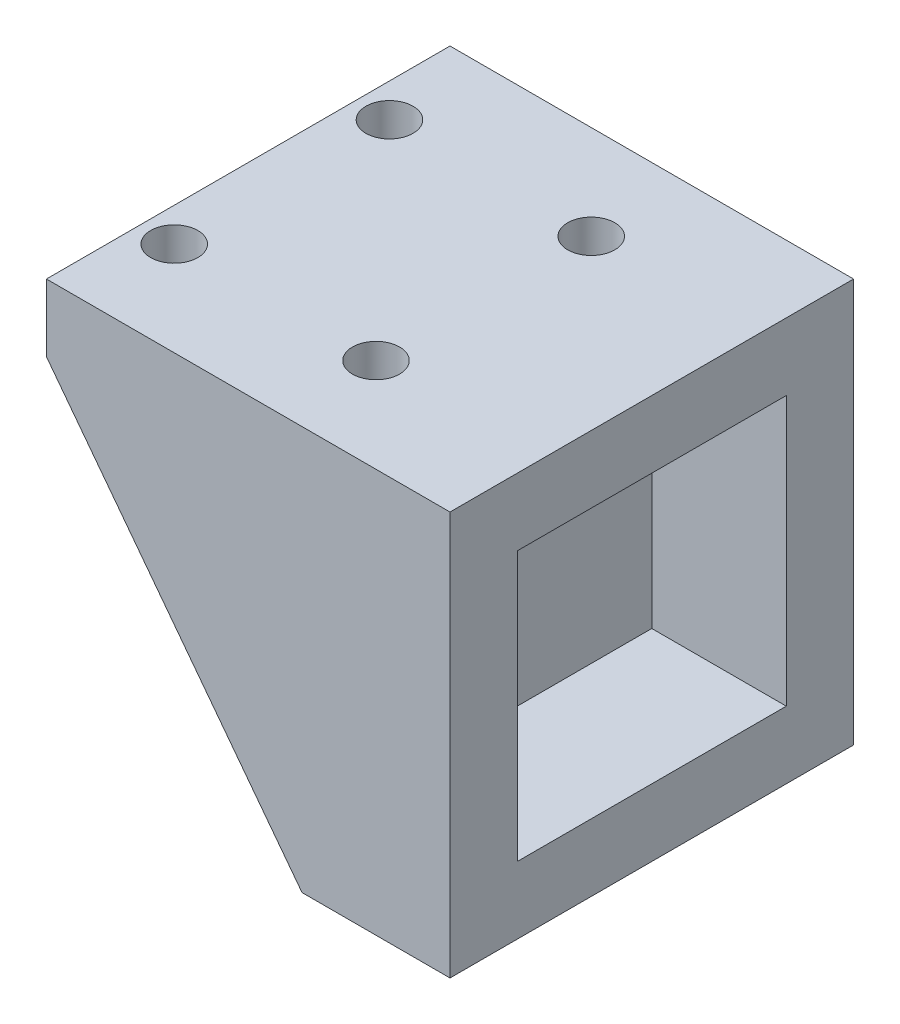
ISO-10303-21;
HEADER;
FILE_DESCRIPTION(('STEP AP214'),'2;1');
FILE_NAME('part.step','',(''),(''),'','','');
FILE_SCHEMA(('AUTOMOTIVE_DESIGN { 1 0 10303 214 1 1 1 1 }'));
ENDSEC;
DATA;
#1=APPLICATION_CONTEXT('core data for automotive mechanical design processes');
#2=APPLICATION_PROTOCOL_DEFINITION('international standard','automotive_design',2000,#1);
#3=PRODUCT_CONTEXT('',#1,'mechanical');
#4=PRODUCT('Part','Part','',(#3));
#5=PRODUCT_RELATED_PRODUCT_CATEGORY('part','',(#4));
#6=PRODUCT_DEFINITION_FORMATION('','',#4);
#7=PRODUCT_DEFINITION_CONTEXT('part definition',#1,'design');
#8=PRODUCT_DEFINITION('design','',#6,#7);
#9=PRODUCT_DEFINITION_SHAPE('','',#8);
#10=(LENGTH_UNIT() NAMED_UNIT(*) SI_UNIT(.MILLI.,.METRE.));
#11=(NAMED_UNIT(*) PLANE_ANGLE_UNIT() SI_UNIT($,.RADIAN.));
#12=(NAMED_UNIT(*) SI_UNIT($,.STERADIAN.) SOLID_ANGLE_UNIT());
#13=UNCERTAINTY_MEASURE_WITH_UNIT(LENGTH_MEASURE(1.E-05),#10,'distance_accuracy_value','');
#14=(GEOMETRIC_REPRESENTATION_CONTEXT(3) GLOBAL_UNCERTAINTY_ASSIGNED_CONTEXT((#13)) GLOBAL_UNIT_ASSIGNED_CONTEXT((#10,
#11,#12)) REPRESENTATION_CONTEXT('',''));
#15=CARTESIAN_POINT('',(0.,0.,0.));
#16=DIRECTION('',(0.,0.,1.));
#17=DIRECTION('',(1.,0.,0.));
#18=AXIS2_PLACEMENT_3D('',#15,#16,#17);
#19=CARTESIAN_POINT('',(17.5,5.,-7.));
#20=DIRECTION('',(0.,-1.,0.));
#21=DIRECTION('',(0.,0.,-1.));
#22=AXIS2_PLACEMENT_3D('',#19,#20,#21);
#23=CYLINDRICAL_SURFACE('',#22,1.75);
#24=CARTESIAN_POINT('',(17.5,5.,-7.));
#25=DIRECTION('',(0.,1.,0.));
#26=DIRECTION('',(0.,0.,1.));
#27=AXIS2_PLACEMENT_3D('',#24,#25,#26);
#28=CIRCLE('',#27,1.75);
#29=CARTESIAN_POINT('',(17.5,5.,-5.25));
#30=VERTEX_POINT('',#29);
#31=EDGE_CURVE('E229',#30,#30,#28,.T.);
#32=ORIENTED_EDGE('',*,*,#31,.T.);
#33=EDGE_LOOP('',(#32));
#34=FACE_BOUND('',#33,.T.);
#35=CARTESIAN_POINT('',(17.5,2.,-7.));
#36=DIRECTION('',(0.,-1.,0.));
#37=DIRECTION('',(0.,0.,-1.));
#38=AXIS2_PLACEMENT_3D('',#35,#36,#37);
#39=CIRCLE('',#38,1.75);
#40=CARTESIAN_POINT('',(17.5,2.,-8.75));
#41=VERTEX_POINT('',#40);
#42=EDGE_CURVE('E264',#41,#41,#39,.T.);
#43=ORIENTED_EDGE('',*,*,#42,.T.);
#44=EDGE_LOOP('',(#43));
#45=FACE_BOUND('',#44,.T.);
#46=ADVANCED_FACE('F33',(#34,#45),#23,.F.);
#47=CARTESIAN_POINT('',(17.5,5.,-23.));
#48=DIRECTION('',(0.,-1.,0.));
#49=DIRECTION('',(0.,0.,-1.));
#50=AXIS2_PLACEMENT_3D('',#47,#48,#49);
#51=CYLINDRICAL_SURFACE('',#50,1.75);
#52=CARTESIAN_POINT('',(17.5,5.,-23.));
#53=DIRECTION('',(0.,1.,0.));
#54=DIRECTION('',(0.,0.,1.));
#55=AXIS2_PLACEMENT_3D('',#52,#53,#54);
#56=CIRCLE('',#55,1.75);
#57=CARTESIAN_POINT('',(17.5,5.,-21.25));
#58=VERTEX_POINT('',#57);
#59=EDGE_CURVE('E215',#58,#58,#56,.T.);
#60=ORIENTED_EDGE('',*,*,#59,.T.);
#61=EDGE_LOOP('',(#60));
#62=FACE_BOUND('',#61,.T.);
#63=CARTESIAN_POINT('',(17.5,2.,-23.));
#64=DIRECTION('',(0.,-1.,0.));
#65=DIRECTION('',(0.,0.,-1.));
#66=AXIS2_PLACEMENT_3D('',#63,#64,#65);
#67=CIRCLE('',#66,1.75);
#68=CARTESIAN_POINT('',(17.5,2.,-24.75));
#69=VERTEX_POINT('',#68);
#70=EDGE_CURVE('E261',#69,#69,#67,.T.);
#71=ORIENTED_EDGE('',*,*,#70,.T.);
#72=EDGE_LOOP('',(#71));
#73=FACE_BOUND('',#72,.T.);
#74=ADVANCED_FACE('F401',(#62,#73),#51,.F.);
#75=CARTESIAN_POINT('',(0.,0.,0.));
#76=DIRECTION('',(0.,-1.,0.));
#77=DIRECTION('',(0.,0.,-1.));
#78=AXIS2_PLACEMENT_3D('',#75,#76,#77);
#79=PLANE('',#78);
#80=CARTESIAN_POINT('',(17.5,0.,-23.));
#81=DIRECTION('',(0.,-1.,0.));
#82=DIRECTION('',(0.,0.,-1.));
#83=AXIS2_PLACEMENT_3D('',#80,#81,#82);
#84=CIRCLE('',#83,2.9);
#85=CARTESIAN_POINT('',(19.,0.,-20.5180652708018));
#86=VERTEX_POINT('',#85);
#87=CARTESIAN_POINT('',(19.,0.,-25.4819347291982));
#88=VERTEX_POINT('',#87);
#89=EDGE_CURVE('E178',#86,#88,#84,.T.);
#90=ORIENTED_EDGE('',*,*,#89,.F.);
#91=DIRECTION('',(0.,0.,-1.));
#92=VECTOR('',#91,1.);
#93=CARTESIAN_POINT('',(19.,0.,0.));
#94=LINE('',#93,#92);
#95=CARTESIAN_POINT('',(19.,0.,-9.48193472919817));
#96=VERTEX_POINT('',#95);
#97=EDGE_CURVE('E163',#96,#86,#94,.T.);
#98=ORIENTED_EDGE('',*,*,#97,.F.);
#99=CARTESIAN_POINT('',(17.5,0.,-7.));
#100=DIRECTION('',(0.,-1.,0.));
#101=DIRECTION('',(0.,0.,-1.));
#102=AXIS2_PLACEMENT_3D('',#99,#100,#101);
#103=CIRCLE('',#102,2.9);
#104=CARTESIAN_POINT('',(19.,0.,-4.51806527080183));
#105=VERTEX_POINT('',#104);
#106=EDGE_CURVE('E169',#105,#96,#103,.T.);
#107=ORIENTED_EDGE('',*,*,#106,.F.);
#108=CARTESIAN_POINT('',(19.,0.,-2.99999999999999));
#109=VERTEX_POINT('',#108);
#110=EDGE_CURVE('E181',#109,#105,#94,.T.);
#111=ORIENTED_EDGE('',*,*,#110,.F.);
#112=DIRECTION('',(-1.,0.,0.));
#113=VECTOR('',#112,1.);
#114=CARTESIAN_POINT('',(0.,0.,-2.99999999999999));
#115=LINE('',#114,#113);
#116=CARTESIAN_POINT('',(0.,0.,-2.99999999999999));
#117=VERTEX_POINT('',#116);
#118=EDGE_CURVE('E338',#109,#117,#115,.T.);
#119=ORIENTED_EDGE('',*,*,#118,.T.);
#120=DIRECTION('',(0.,0.,1.));
#121=VECTOR('',#120,1.);
#122=CARTESIAN_POINT('',(0.,0.,0.));
#123=LINE('',#122,#121);
#124=CARTESIAN_POINT('',(0.,0.,-27.));
#125=VERTEX_POINT('',#124);
#126=EDGE_CURVE('E237',#125,#117,#123,.T.);
#127=ORIENTED_EDGE('',*,*,#126,.F.);
#128=DIRECTION('',(1.,0.,0.));
#129=VECTOR('',#128,1.);
#130=CARTESIAN_POINT('',(19.,0.,-27.));
#131=LINE('',#130,#129);
#132=CARTESIAN_POINT('',(19.,0.,-27.));
#133=VERTEX_POINT('',#132);
#134=EDGE_CURVE('E352',#125,#133,#131,.T.);
#135=ORIENTED_EDGE('',*,*,#134,.T.);
#136=EDGE_CURVE('E179',#88,#133,#94,.T.);
#137=ORIENTED_EDGE('',*,*,#136,.F.);
#138=EDGE_LOOP('',(#90,#98,#107,#111,#119,#127,#135,#137));
#139=FACE_BOUND('',#138,.T.);
#140=CARTESIAN_POINT('',(2.5,0.,-23.));
#141=DIRECTION('',(0.,1.,0.));
#142=DIRECTION('',(0.,0.,1.));
#143=AXIS2_PLACEMENT_3D('',#140,#141,#142);
#144=CIRCLE('',#143,1.75);
#145=CARTESIAN_POINT('',(2.5,0.,-21.25));
#146=VERTEX_POINT('',#145);
#147=EDGE_CURVE('E221',#146,#146,#144,.T.);
#148=ORIENTED_EDGE('',*,*,#147,.T.);
#149=EDGE_LOOP('',(#148));
#150=FACE_BOUND('',#149,.T.);
#151=CARTESIAN_POINT('',(2.5,0.,-7.));
#152=DIRECTION('',(0.,1.,0.));
#153=DIRECTION('',(0.,0.,1.));
#154=AXIS2_PLACEMENT_3D('',#151,#152,#153);
#155=CIRCLE('',#154,1.75);
#156=CARTESIAN_POINT('',(2.5,0.,-5.25));
#157=VERTEX_POINT('',#156);
#158=EDGE_CURVE('E233',#157,#157,#155,.T.);
#159=ORIENTED_EDGE('',*,*,#158,.T.);
#160=EDGE_LOOP('',(#159));
#161=FACE_BOUND('',#160,.T.);
#162=ADVANCED_FACE('F175',(#139,#150,#161),#79,.T.);
#163=CARTESIAN_POINT('',(19.,-25.,0.));
#164=DIRECTION('',(1.,0.,0.));
#165=DIRECTION('',(0.,0.,-1.));
#166=AXIS2_PLACEMENT_3D('',#163,#164,#165);
#167=PLANE('',#166);
#168=DIRECTION('',(0.,0.,-1.));
#169=VECTOR('',#168,1.);
#170=CARTESIAN_POINT('',(19.,-3.73205080756889,-25.4819347291982));
#171=LINE('',#170,#169);
#172=CARTESIAN_POINT('',(19.,-3.73205080756889,-20.5180652708018));
#173=VERTEX_POINT('',#172);
#174=CARTESIAN_POINT('',(19.,-3.73205080756889,-25.4819347291982));
#175=VERTEX_POINT('',#174);
#176=EDGE_CURVE('E271',#173,#175,#171,.T.);
#177=ORIENTED_EDGE('',*,*,#176,.T.);
#178=DIRECTION('',(0.,-1.,0.));
#179=VECTOR('',#178,1.);
#180=CARTESIAN_POINT('',(19.,-3.73205080756889,-25.4819347291982));
#181=LINE('',#180,#179);
#182=EDGE_CURVE('E273',#175,#88,#181,.F.);
#183=ORIENTED_EDGE('',*,*,#182,.T.);
#184=ORIENTED_EDGE('',*,*,#136,.T.);
#185=DIRECTION('',(0.,-1.,0.));
#186=VECTOR('',#185,1.);
#187=CARTESIAN_POINT('',(19.,-25.,-27.));
#188=LINE('',#187,#186);
#189=CARTESIAN_POINT('',(19.,-25.,-27.));
#190=VERTEX_POINT('',#189);
#191=EDGE_CURVE('E355',#133,#190,#188,.T.);
#192=ORIENTED_EDGE('',*,*,#191,.T.);
#193=DIRECTION('',(0.,0.,-1.));
#194=VECTOR('',#193,1.);
#195=CARTESIAN_POINT('',(19.,-25.,0.));
#196=LINE('',#195,#194);
#197=CARTESIAN_POINT('',(19.,-25.,-2.99999999999999));
#198=VERTEX_POINT('',#197);
#199=EDGE_CURVE('E210',#198,#190,#196,.T.);
#200=ORIENTED_EDGE('',*,*,#199,.F.);
#201=DIRECTION('',(0.,1.,0.));
#202=VECTOR('',#201,1.);
#203=CARTESIAN_POINT('',(19.,0.,-2.99999999999999));
#204=LINE('',#203,#202);
#205=EDGE_CURVE('E336',#198,#109,#204,.T.);
#206=ORIENTED_EDGE('',*,*,#205,.T.);
#207=ORIENTED_EDGE('',*,*,#110,.T.);
#208=DIRECTION('',(0.,-1.,0.));
#209=VECTOR('',#208,1.);
#210=CARTESIAN_POINT('',(19.,0.,-4.51806527080183));
#211=LINE('',#210,#209);
#212=CARTESIAN_POINT('',(19.,-3.73205080756887,-4.51806527080183));
#213=VERTEX_POINT('',#212);
#214=EDGE_CURVE('E47',#105,#213,#211,.T.);
#215=ORIENTED_EDGE('',*,*,#214,.T.);
#216=DIRECTION('',(0.,0.,-1.));
#217=VECTOR('',#216,1.);
#218=CARTESIAN_POINT('',(19.,-3.73205080756887,-9.48193472919817));
#219=LINE('',#218,#217);
#220=CARTESIAN_POINT('',(19.,-3.73205080756887,-9.48193472919817));
#221=VERTEX_POINT('',#220);
#222=EDGE_CURVE('E166',#213,#221,#219,.T.);
#223=ORIENTED_EDGE('',*,*,#222,.T.);
#224=DIRECTION('',(0.,-1.,0.));
#225=VECTOR('',#224,1.);
#226=CARTESIAN_POINT('',(19.,-3.73205080756887,-9.48193472919817));
#227=LINE('',#226,#225);
#228=EDGE_CURVE('E159',#221,#96,#227,.F.);
#229=ORIENTED_EDGE('',*,*,#228,.T.);
#230=ORIENTED_EDGE('',*,*,#97,.T.);
#231=DIRECTION('',(0.,-1.,0.));
#232=VECTOR('',#231,1.);
#233=CARTESIAN_POINT('',(19.,0.,-20.5180652708018));
#234=LINE('',#233,#232);
#235=EDGE_CURVE('E55',#86,#173,#234,.T.);
#236=ORIENTED_EDGE('',*,*,#235,.T.);
#237=EDGE_LOOP('',(#177,#183,#184,#192,#200,#206,#207,#215,#223,#229,#230,#236));
#238=FACE_BOUND('',#237,.T.);
#239=ADVANCED_FACE('F161',(#238),#167,.F.);
#240=CARTESIAN_POINT('',(0.,5.,0.));
#241=DIRECTION('',(0.,-1.,0.));
#242=DIRECTION('',(0.,0.,-1.));
#243=AXIS2_PLACEMENT_3D('',#240,#241,#242);
#244=PLANE('',#243);
#245=DIRECTION('',(0.,0.,1.));
#246=VECTOR('',#245,1.);
#247=CARTESIAN_POINT('',(0.,5.,0.));
#248=LINE('',#247,#246);
#249=CARTESIAN_POINT('',(0.,5.,-30.));
#250=VERTEX_POINT('',#249);
#251=CARTESIAN_POINT('',(0.,5.,0.));
#252=VERTEX_POINT('',#251);
#253=EDGE_CURVE('E240',#250,#252,#248,.T.);
#254=ORIENTED_EDGE('',*,*,#253,.T.);
#255=DIRECTION('',(1.,0.,0.));
#256=VECTOR('',#255,1.);
#257=CARTESIAN_POINT('',(0.,5.,0.));
#258=LINE('',#257,#256);
#259=CARTESIAN_POINT('',(30.,5.,0.));
#260=VERTEX_POINT('',#259);
#261=EDGE_CURVE('E243',#252,#260,#258,.T.);
#262=ORIENTED_EDGE('',*,*,#261,.T.);
#263=DIRECTION('',(0.,0.,-1.));
#264=VECTOR('',#263,1.);
#265=CARTESIAN_POINT('',(30.,5.,0.));
#266=LINE('',#265,#264);
#267=CARTESIAN_POINT('',(30.,5.,-30.));
#268=VERTEX_POINT('',#267);
#269=EDGE_CURVE('E246',#260,#268,#266,.T.);
#270=ORIENTED_EDGE('',*,*,#269,.T.);
#271=DIRECTION('',(-1.,0.,0.));
#272=VECTOR('',#271,1.);
#273=CARTESIAN_POINT('',(0.,5.,-30.));
#274=LINE('',#273,#272);
#275=EDGE_CURVE('E248',#268,#250,#274,.T.);
#276=ORIENTED_EDGE('',*,*,#275,.T.);
#277=EDGE_LOOP('',(#254,#262,#270,#276));
#278=FACE_BOUND('',#277,.T.);
#279=CARTESIAN_POINT('',(2.5,5.,-7.));
#280=DIRECTION('',(0.,1.,0.));
#281=DIRECTION('',(0.,0.,1.));
#282=AXIS2_PLACEMENT_3D('',#279,#280,#281);
#283=CIRCLE('',#282,1.75);
#284=CARTESIAN_POINT('',(2.5,5.,-5.25));
#285=VERTEX_POINT('',#284);
#286=EDGE_CURVE('E234',#285,#285,#283,.T.);
#287=ORIENTED_EDGE('',*,*,#286,.F.);
#288=EDGE_LOOP('',(#287));
#289=FACE_BOUND('',#288,.T.);
#290=ORIENTED_EDGE('',*,*,#31,.F.);
#291=EDGE_LOOP('',(#290));
#292=FACE_BOUND('',#291,.T.);
#293=CARTESIAN_POINT('',(2.5,5.,-23.));
#294=DIRECTION('',(0.,1.,0.));
#295=DIRECTION('',(0.,0.,1.));
#296=AXIS2_PLACEMENT_3D('',#293,#294,#295);
#297=CIRCLE('',#296,1.75);
#298=CARTESIAN_POINT('',(2.5,5.,-21.25));
#299=VERTEX_POINT('',#298);
#300=EDGE_CURVE('E225',#299,#299,#297,.T.);
#301=ORIENTED_EDGE('',*,*,#300,.F.);
#302=EDGE_LOOP('',(#301));
#303=FACE_BOUND('',#302,.T.);
#304=ORIENTED_EDGE('',*,*,#59,.F.);
#305=EDGE_LOOP('',(#304));
#306=FACE_BOUND('',#305,.T.);
#307=ADVANCED_FACE('F416',(#278,#289,#292,#303,#306),#244,.F.);
#308=CARTESIAN_POINT('',(0.,5.,0.));
#309=DIRECTION('',(1.,0.,0.));
#310=DIRECTION('',(0.,0.,-1.));
#311=AXIS2_PLACEMENT_3D('',#308,#309,#310);
#312=PLANE('',#311);
#313=CARTESIAN_POINT('',(0.,0.,-30.));
#314=VERTEX_POINT('',#313);
#315=EDGE_CURVE('E244',#314,#125,#123,.T.);
#316=ORIENTED_EDGE('',*,*,#315,.T.);
#317=ORIENTED_EDGE('',*,*,#126,.T.);
#318=DIRECTION('',(0.,0.,1.));
#319=VECTOR('',#318,1.);
#320=CARTESIAN_POINT('',(0.,0.,-2.99999999999999));
#321=LINE('',#320,#319);
#322=CARTESIAN_POINT('',(0.,0.,0.));
#323=VERTEX_POINT('',#322);
#324=EDGE_CURVE('E343',#117,#323,#321,.T.);
#325=ORIENTED_EDGE('',*,*,#324,.T.);
#326=DIRECTION('',(0.,-1.,0.));
#327=VECTOR('',#326,1.);
#328=CARTESIAN_POINT('',(0.,5.,0.));
#329=LINE('',#328,#327);
#330=EDGE_CURVE('E183',#252,#323,#329,.T.);
#331=ORIENTED_EDGE('',*,*,#330,.F.);
#332=ORIENTED_EDGE('',*,*,#253,.F.);
#333=DIRECTION('',(0.,-1.,0.));
#334=VECTOR('',#333,1.);
#335=CARTESIAN_POINT('',(0.,5.,-30.));
#336=LINE('',#335,#334);
#337=EDGE_CURVE('E250',#250,#314,#336,.T.);
#338=ORIENTED_EDGE('',*,*,#337,.T.);
#339=EDGE_LOOP('',(#316,#317,#325,#331,#332,#338));
#340=FACE_BOUND('',#339,.T.);
#341=ADVANCED_FACE('F382',(#340),#312,.F.);
#342=CARTESIAN_POINT('',(0.,5.,0.));
#343=DIRECTION('',(0.,0.,-1.));
#344=DIRECTION('',(-1.,0.,0.));
#345=AXIS2_PLACEMENT_3D('',#342,#343,#344);
#346=PLANE('',#345);
#347=ORIENTED_EDGE('',*,*,#330,.T.);
#348=DIRECTION('',(0.605083267533558,-0.796162194123103,0.));
#349=VECTOR('',#348,1.);
#350=CARTESIAN_POINT('',(19.,-25.,0.));
#351=LINE('',#350,#349);
#352=CARTESIAN_POINT('',(19.,-25.,0.));
#353=VERTEX_POINT('',#352);
#354=EDGE_CURVE('E267',#323,#353,#351,.T.);
#355=ORIENTED_EDGE('',*,*,#354,.T.);
#356=DIRECTION('',(-1.,0.,0.));
#357=VECTOR('',#356,1.);
#358=CARTESIAN_POINT('',(30.,-25.,0.));
#359=LINE('',#358,#357);
#360=CARTESIAN_POINT('',(30.,-25.,0.));
#361=VERTEX_POINT('',#360);
#362=EDGE_CURVE('E190',#361,#353,#359,.T.);
#363=ORIENTED_EDGE('',*,*,#362,.F.);
#364=DIRECTION('',(0.,-1.,0.));
#365=VECTOR('',#364,1.);
#366=CARTESIAN_POINT('',(30.,5.,0.));
#367=LINE('',#366,#365);
#368=EDGE_CURVE('E257',#260,#361,#367,.T.);
#369=ORIENTED_EDGE('',*,*,#368,.F.);
#370=ORIENTED_EDGE('',*,*,#261,.F.);
#371=EDGE_LOOP('',(#347,#355,#363,#369,#370));
#372=FACE_BOUND('',#371,.T.);
#373=ADVANCED_FACE('F375',(#372),#346,.F.);
#374=CARTESIAN_POINT('',(30.,5.,0.));
#375=DIRECTION('',(-1.,0.,0.));
#376=DIRECTION('',(0.,0.,1.));
#377=AXIS2_PLACEMENT_3D('',#374,#375,#376);
#378=PLANE('',#377);
#379=DIRECTION('',(0.,0.,1.));
#380=VECTOR('',#379,1.);
#381=CARTESIAN_POINT('',(30.,0.,-25.));
#382=LINE('',#381,#380);
#383=CARTESIAN_POINT('',(30.,0.,-25.));
#384=VERTEX_POINT('',#383);
#385=CARTESIAN_POINT('',(30.,0.,-4.99999999999999));
#386=VERTEX_POINT('',#385);
#387=EDGE_CURVE('E315',#384,#386,#382,.T.);
#388=ORIENTED_EDGE('',*,*,#387,.F.);
#389=DIRECTION('',(0.,1.,0.));
#390=VECTOR('',#389,1.);
#391=CARTESIAN_POINT('',(30.,-20.,-25.));
#392=LINE('',#391,#390);
#393=CARTESIAN_POINT('',(30.,-20.,-25.));
#394=VERTEX_POINT('',#393);
#395=EDGE_CURVE('E313',#394,#384,#392,.T.);
#396=ORIENTED_EDGE('',*,*,#395,.F.);
#397=DIRECTION('',(0.,0.,-1.));
#398=VECTOR('',#397,1.);
#399=CARTESIAN_POINT('',(30.,-20.,-25.));
#400=LINE('',#399,#398);
#401=CARTESIAN_POINT('',(30.,-20.,-4.99999999999999));
#402=VERTEX_POINT('',#401);
#403=EDGE_CURVE('E200',#402,#394,#400,.T.);
#404=ORIENTED_EDGE('',*,*,#403,.F.);
#405=DIRECTION('',(0.,-1.,0.));
#406=VECTOR('',#405,1.);
#407=CARTESIAN_POINT('',(30.,-20.,-4.99999999999999));
#408=LINE('',#407,#406);
#409=EDGE_CURVE('E318',#386,#402,#408,.T.);
#410=ORIENTED_EDGE('',*,*,#409,.F.);
#411=EDGE_LOOP('',(#388,#396,#404,#410));
#412=FACE_BOUND('',#411,.T.);
#413=ORIENTED_EDGE('',*,*,#368,.T.);
#414=DIRECTION('',(0.,0.,1.));
#415=VECTOR('',#414,1.);
#416=CARTESIAN_POINT('',(30.,-25.,0.));
#417=LINE('',#416,#415);
#418=CARTESIAN_POINT('',(30.,-25.,-30.));
#419=VERTEX_POINT('',#418);
#420=EDGE_CURVE('E186',#419,#361,#417,.T.);
#421=ORIENTED_EDGE('',*,*,#420,.F.);
#422=DIRECTION('',(0.,-1.,0.));
#423=VECTOR('',#422,1.);
#424=CARTESIAN_POINT('',(30.,5.,-30.));
#425=LINE('',#424,#423);
#426=EDGE_CURVE('E255',#268,#419,#425,.T.);
#427=ORIENTED_EDGE('',*,*,#426,.F.);
#428=ORIENTED_EDGE('',*,*,#269,.F.);
#429=EDGE_LOOP('',(#413,#421,#427,#428));
#430=FACE_BOUND('',#429,.T.);
#431=ADVANCED_FACE('F371',(#412,#430),#378,.F.);
#432=CARTESIAN_POINT('',(0.,5.,-30.));
#433=DIRECTION('',(0.,0.,1.));
#434=DIRECTION('',(1.,0.,0.));
#435=AXIS2_PLACEMENT_3D('',#432,#433,#434);
#436=PLANE('',#435);
#437=DIRECTION('',(-0.605083267533558,0.796162194123102,0.));
#438=VECTOR('',#437,1.);
#439=CARTESIAN_POINT('',(0.,0.,-30.));
#440=LINE('',#439,#438);
#441=CARTESIAN_POINT('',(19.,-25.,-30.));
#442=VERTEX_POINT('',#441);
#443=EDGE_CURVE('E348',#442,#314,#440,.T.);
#444=ORIENTED_EDGE('',*,*,#443,.T.);
#445=ORIENTED_EDGE('',*,*,#337,.F.);
#446=ORIENTED_EDGE('',*,*,#275,.F.);
#447=ORIENTED_EDGE('',*,*,#426,.T.);
#448=DIRECTION('',(1.,0.,0.));
#449=VECTOR('',#448,1.);
#450=CARTESIAN_POINT('',(30.,-25.,-30.));
#451=LINE('',#450,#449);
#452=EDGE_CURVE('E213',#442,#419,#451,.T.);
#453=ORIENTED_EDGE('',*,*,#452,.F.);
#454=EDGE_LOOP('',(#444,#445,#446,#447,#453));
#455=FACE_BOUND('',#454,.T.);
#456=ADVANCED_FACE('F365',(#455),#436,.F.);
#457=CARTESIAN_POINT('',(2.5,5.,-7.));
#458=DIRECTION('',(0.,-1.,0.));
#459=DIRECTION('',(0.,0.,-1.));
#460=AXIS2_PLACEMENT_3D('',#457,#458,#459);
#461=CYLINDRICAL_SURFACE('',#460,1.75);
#462=ORIENTED_EDGE('',*,*,#286,.T.);
#463=EDGE_LOOP('',(#462));
#464=FACE_BOUND('',#463,.T.);
#465=ORIENTED_EDGE('',*,*,#158,.F.);
#466=EDGE_LOOP('',(#465));
#467=FACE_BOUND('',#466,.T.);
#468=ADVANCED_FACE('F412',(#464,#467),#461,.F.);
#469=CARTESIAN_POINT('',(2.5,5.,-23.));
#470=DIRECTION('',(0.,-1.,0.));
#471=DIRECTION('',(0.,0.,-1.));
#472=AXIS2_PLACEMENT_3D('',#469,#470,#471);
#473=CYLINDRICAL_SURFACE('',#472,1.75);
#474=ORIENTED_EDGE('',*,*,#300,.T.);
#475=EDGE_LOOP('',(#474));
#476=FACE_BOUND('',#475,.T.);
#477=ORIENTED_EDGE('',*,*,#147,.F.);
#478=EDGE_LOOP('',(#477));
#479=FACE_BOUND('',#478,.T.);
#480=ADVANCED_FACE('F411',(#476,#479),#473,.F.);
#481=CARTESIAN_POINT('',(0.,-25.,0.));
#482=DIRECTION('',(0.,1.,0.));
#483=DIRECTION('',(0.,0.,1.));
#484=AXIS2_PLACEMENT_3D('',#481,#482,#483);
#485=PLANE('',#484);
#486=ORIENTED_EDGE('',*,*,#420,.T.);
#487=ORIENTED_EDGE('',*,*,#362,.T.);
#488=EDGE_CURVE('E211',#353,#198,#196,.T.);
#489=ORIENTED_EDGE('',*,*,#488,.T.);
#490=ORIENTED_EDGE('',*,*,#199,.T.);
#491=DIRECTION('',(0.,0.,-1.));
#492=VECTOR('',#491,1.);
#493=CARTESIAN_POINT('',(19.,-25.,-27.));
#494=LINE('',#493,#492);
#495=EDGE_CURVE('E316',#190,#442,#494,.T.);
#496=ORIENTED_EDGE('',*,*,#495,.T.);
#497=ORIENTED_EDGE('',*,*,#452,.T.);
#498=EDGE_LOOP('',(#486,#487,#489,#490,#496,#497));
#499=FACE_BOUND('',#498,.T.);
#500=ADVANCED_FACE('F360',(#499),#485,.F.);
#501=CARTESIAN_POINT('',(20.,-20.,-25.));
#502=DIRECTION('',(0.,0.,-1.));
#503=DIRECTION('',(0.,1.,0.));
#504=AXIS2_PLACEMENT_3D('',#501,#502,#503);
#505=PLANE('',#504);
#506=ORIENTED_EDGE('',*,*,#395,.T.);
#507=DIRECTION('',(1.,0.,0.));
#508=VECTOR('',#507,1.);
#509=CARTESIAN_POINT('',(20.,0.,-25.));
#510=LINE('',#509,#508);
#511=CARTESIAN_POINT('',(20.,0.,-25.));
#512=VERTEX_POINT('',#511);
#513=EDGE_CURVE('E204',#512,#384,#510,.T.);
#514=ORIENTED_EDGE('',*,*,#513,.F.);
#515=DIRECTION('',(0.,1.,0.));
#516=VECTOR('',#515,1.);
#517=CARTESIAN_POINT('',(20.,-20.,-25.));
#518=LINE('',#517,#516);
#519=CARTESIAN_POINT('',(20.,-20.,-25.));
#520=VERTEX_POINT('',#519);
#521=EDGE_CURVE('E303',#520,#512,#518,.T.);
#522=ORIENTED_EDGE('',*,*,#521,.F.);
#523=DIRECTION('',(1.,0.,0.));
#524=VECTOR('',#523,1.);
#525=CARTESIAN_POINT('',(20.,-20.,-25.));
#526=LINE('',#525,#524);
#527=EDGE_CURVE('E187',#520,#394,#526,.T.);
#528=ORIENTED_EDGE('',*,*,#527,.T.);
#529=EDGE_LOOP('',(#506,#514,#522,#528));
#530=FACE_BOUND('',#529,.T.);
#531=ADVANCED_FACE('F327',(#530),#505,.F.);
#532=CARTESIAN_POINT('',(20.,-20.,-25.));
#533=DIRECTION('',(0.,-1.,0.));
#534=DIRECTION('',(0.,0.,-1.));
#535=AXIS2_PLACEMENT_3D('',#532,#533,#534);
#536=PLANE('',#535);
#537=ORIENTED_EDGE('',*,*,#403,.T.);
#538=ORIENTED_EDGE('',*,*,#527,.F.);
#539=DIRECTION('',(0.,0.,-1.));
#540=VECTOR('',#539,1.);
#541=CARTESIAN_POINT('',(20.,-20.,-25.));
#542=LINE('',#541,#540);
#543=CARTESIAN_POINT('',(20.,-20.,-4.99999999999999));
#544=VERTEX_POINT('',#543);
#545=EDGE_CURVE('E206',#544,#520,#542,.T.);
#546=ORIENTED_EDGE('',*,*,#545,.F.);
#547=DIRECTION('',(1.,0.,0.));
#548=VECTOR('',#547,1.);
#549=CARTESIAN_POINT('',(20.,-20.,-4.99999999999999));
#550=LINE('',#549,#548);
#551=EDGE_CURVE('E192',#544,#402,#550,.T.);
#552=ORIENTED_EDGE('',*,*,#551,.T.);
#553=EDGE_LOOP('',(#537,#538,#546,#552));
#554=FACE_BOUND('',#553,.T.);
#555=ADVANCED_FACE('F567',(#554),#536,.F.);
#556=CARTESIAN_POINT('',(20.,-20.,-4.99999999999999));
#557=DIRECTION('',(0.,0.,1.));
#558=DIRECTION('',(0.,-1.,0.));
#559=AXIS2_PLACEMENT_3D('',#556,#557,#558);
#560=PLANE('',#559);
#561=ORIENTED_EDGE('',*,*,#409,.T.);
#562=ORIENTED_EDGE('',*,*,#551,.F.);
#563=DIRECTION('',(0.,-1.,0.));
#564=VECTOR('',#563,1.);
#565=CARTESIAN_POINT('',(20.,-20.,-4.99999999999999));
#566=LINE('',#565,#564);
#567=CARTESIAN_POINT('',(20.,0.,-4.99999999999999));
#568=VERTEX_POINT('',#567);
#569=EDGE_CURVE('E307',#568,#544,#566,.T.);
#570=ORIENTED_EDGE('',*,*,#569,.F.);
#571=DIRECTION('',(1.,0.,0.));
#572=VECTOR('',#571,1.);
#573=CARTESIAN_POINT('',(20.,0.,-4.99999999999999));
#574=LINE('',#573,#572);
#575=EDGE_CURVE('E197',#568,#386,#574,.T.);
#576=ORIENTED_EDGE('',*,*,#575,.T.);
#577=EDGE_LOOP('',(#561,#562,#570,#576));
#578=FACE_BOUND('',#577,.T.);
#579=ADVANCED_FACE('F507',(#578),#560,.F.);
#580=CARTESIAN_POINT('',(20.,0.,-25.));
#581=DIRECTION('',(0.,1.,0.));
#582=DIRECTION('',(0.,0.,1.));
#583=AXIS2_PLACEMENT_3D('',#580,#581,#582);
#584=PLANE('',#583);
#585=DIRECTION('',(0.,0.,1.));
#586=VECTOR('',#585,1.);
#587=CARTESIAN_POINT('',(20.,0.,-25.));
#588=LINE('',#587,#586);
#589=CARTESIAN_POINT('',(20.,0.,-21.5303061543301));
#590=VERTEX_POINT('',#589);
#591=CARTESIAN_POINT('',(20.,0.,-8.46969384566992));
#592=VERTEX_POINT('',#591);
#593=EDGE_CURVE('E287',#590,#592,#588,.T.);
#594=ORIENTED_EDGE('',*,*,#593,.F.);
#595=CARTESIAN_POINT('',(20.,0.,-24.4696938456699));
#596=VERTEX_POINT('',#595);
#597=EDGE_CURVE('E329',#596,#590,#84,.T.);
#598=ORIENTED_EDGE('',*,*,#597,.F.);
#599=EDGE_CURVE('E304',#512,#596,#588,.T.);
#600=ORIENTED_EDGE('',*,*,#599,.F.);
#601=ORIENTED_EDGE('',*,*,#513,.T.);
#602=ORIENTED_EDGE('',*,*,#387,.T.);
#603=ORIENTED_EDGE('',*,*,#575,.F.);
#604=CARTESIAN_POINT('',(20.,0.,-5.53030615433009));
#605=VERTEX_POINT('',#604);
#606=EDGE_CURVE('E290',#605,#568,#588,.T.);
#607=ORIENTED_EDGE('',*,*,#606,.F.);
#608=EDGE_CURVE('E173',#592,#605,#103,.T.);
#609=ORIENTED_EDGE('',*,*,#608,.F.);
#610=EDGE_LOOP('',(#594,#598,#600,#601,#602,#603,#607,#609));
#611=FACE_BOUND('',#610,.T.);
#612=ADVANCED_FACE('F285',(#611),#584,.F.);
#613=CARTESIAN_POINT('',(20.,0.,0.));
#614=DIRECTION('',(1.,0.,0.));
#615=DIRECTION('',(0.,0.,-1.));
#616=AXIS2_PLACEMENT_3D('',#613,#614,#615);
#617=PLANE('',#616);
#618=ORIENTED_EDGE('',*,*,#521,.T.);
#619=ORIENTED_EDGE('',*,*,#599,.T.);
#620=EDGE_CURVE('E300',#596,#590,#588,.T.);
#621=ORIENTED_EDGE('',*,*,#620,.T.);
#622=ORIENTED_EDGE('',*,*,#593,.T.);
#623=EDGE_CURVE('E296',#592,#605,#588,.T.);
#624=ORIENTED_EDGE('',*,*,#623,.T.);
#625=ORIENTED_EDGE('',*,*,#606,.T.);
#626=ORIENTED_EDGE('',*,*,#569,.T.);
#627=ORIENTED_EDGE('',*,*,#545,.T.);
#628=EDGE_LOOP('',(#618,#619,#621,#622,#624,#625,#626,#627));
#629=FACE_BOUND('',#628,.T.);
#630=ADVANCED_FACE('F295',(#629),#617,.T.);
#631=CARTESIAN_POINT('',(0.,0.,-27.));
#632=DIRECTION('',(-0.796162194123103,-0.605083267533558,0.));
#633=DIRECTION('',(0.605083267533558,-0.796162194123103,0.));
#634=AXIS2_PLACEMENT_3D('',#631,#632,#633);
#635=PLANE('',#634);
#636=ORIENTED_EDGE('',*,*,#443,.F.);
#637=ORIENTED_EDGE('',*,*,#495,.F.);
#638=DIRECTION('',(-0.605083267533558,0.796162194123102,0.));
#639=VECTOR('',#638,1.);
#640=CARTESIAN_POINT('',(0.,0.,-27.));
#641=LINE('',#640,#639);
#642=EDGE_CURVE('E349',#190,#125,#641,.T.);
#643=ORIENTED_EDGE('',*,*,#642,.T.);
#644=ORIENTED_EDGE('',*,*,#315,.F.);
#645=EDGE_LOOP('',(#636,#637,#643,#644));
#646=FACE_BOUND('',#645,.T.);
#647=ADVANCED_FACE('F391',(#646),#635,.T.);
#648=CARTESIAN_POINT('',(0.,0.,-27.));
#649=DIRECTION('',(0.,0.,-1.));
#650=DIRECTION('',(-1.,0.,0.));
#651=AXIS2_PLACEMENT_3D('',#648,#649,#650);
#652=PLANE('',#651);
#653=ORIENTED_EDGE('',*,*,#642,.F.);
#654=ORIENTED_EDGE('',*,*,#191,.F.);
#655=ORIENTED_EDGE('',*,*,#134,.F.);
#656=EDGE_LOOP('',(#653,#654,#655));
#657=FACE_BOUND('',#656,.T.);
#658=ADVANCED_FACE('F390',(#657),#652,.F.);
#659=CARTESIAN_POINT('',(19.,-25.,-2.99999999999999));
#660=DIRECTION('',(-0.796162194123103,-0.605083267533558,0.));
#661=DIRECTION('',(0.605083267533558,-0.796162194123103,0.));
#662=AXIS2_PLACEMENT_3D('',#659,#660,#661);
#663=PLANE('',#662);
#664=ORIENTED_EDGE('',*,*,#354,.F.);
#665=ORIENTED_EDGE('',*,*,#324,.F.);
#666=DIRECTION('',(0.605083267533558,-0.796162194123103,0.));
#667=VECTOR('',#666,1.);
#668=CARTESIAN_POINT('',(19.,-25.,-2.99999999999999));
#669=LINE('',#668,#667);
#670=EDGE_CURVE('E341',#117,#198,#669,.T.);
#671=ORIENTED_EDGE('',*,*,#670,.T.);
#672=ORIENTED_EDGE('',*,*,#488,.F.);
#673=EDGE_LOOP('',(#664,#665,#671,#672));
#674=FACE_BOUND('',#673,.T.);
#675=ADVANCED_FACE('F378',(#674),#663,.T.);
#676=CARTESIAN_POINT('',(0.,0.,-2.99999999999999));
#677=DIRECTION('',(0.,0.,1.));
#678=DIRECTION('',(1.,0.,0.));
#679=AXIS2_PLACEMENT_3D('',#676,#677,#678);
#680=PLANE('',#679);
#681=ORIENTED_EDGE('',*,*,#205,.F.);
#682=ORIENTED_EDGE('',*,*,#670,.F.);
#683=ORIENTED_EDGE('',*,*,#118,.F.);
#684=EDGE_LOOP('',(#681,#682,#683));
#685=FACE_BOUND('',#684,.T.);
#686=ADVANCED_FACE('F387',(#685),#680,.F.);
#687=CARTESIAN_POINT('',(17.5,2.,-7.));
#688=DIRECTION('',(0.,-1.,0.));
#689=DIRECTION('',(0.,0.,-1.));
#690=AXIS2_PLACEMENT_3D('',#687,#688,#689);
#691=CYLINDRICAL_SURFACE('',#690,2.9);
#692=CARTESIAN_POINT('',(17.5,2.,-7.));
#693=DIRECTION('',(0.,-1.,0.));
#694=DIRECTION('',(0.,0.,-1.));
#695=AXIS2_PLACEMENT_3D('',#692,#693,#694);
#696=CIRCLE('',#695,2.9);
#697=CARTESIAN_POINT('',(17.5,2.,-9.9));
#698=VERTEX_POINT('',#697);
#699=EDGE_CURVE('E292',#698,#698,#696,.T.);
#700=ORIENTED_EDGE('',*,*,#699,.F.);
#701=EDGE_LOOP('',(#700));
#702=FACE_BOUND('',#701,.T.);
#703=ORIENTED_EDGE('',*,*,#106,.T.);
#704=ORIENTED_EDGE('',*,*,#228,.F.);
#705=CARTESIAN_POINT('',(17.5,-9.33012701892217,-7.));
#706=DIRECTION('',(-0.965925826289068,0.258819045102521,0.));
#707=DIRECTION('',(-0.258819045102521,-0.965925826289068,0.));
#708=AXIS2_PLACEMENT_3D('',#705,#706,#707);
#709=ELLIPSE('',#708,11.2047395849532,2.9);
#710=EDGE_CURVE('E41',#221,#592,#709,.F.);
#711=ORIENTED_EDGE('',*,*,#710,.T.);
#712=ORIENTED_EDGE('',*,*,#608,.T.);
#713=CARTESIAN_POINT('',(17.5,-9.33012701892217,-7.));
#714=DIRECTION('',(-0.965925826289068,0.258819045102521,0.));
#715=DIRECTION('',(-0.258819045102521,-0.965925826289068,0.));
#716=AXIS2_PLACEMENT_3D('',#713,#714,#715);
#717=ELLIPSE('',#716,11.2047395849532,2.9);
#718=EDGE_CURVE('E11',#605,#213,#717,.F.);
#719=ORIENTED_EDGE('',*,*,#718,.T.);
#720=ORIENTED_EDGE('',*,*,#214,.F.);
#721=EDGE_LOOP('',(#703,#704,#711,#712,#719,#720));
#722=FACE_BOUND('',#721,.T.);
#723=ADVANCED_FACE('F170',(#702,#722),#691,.F.);
#724=CARTESIAN_POINT('',(17.5,2.,-7.));
#725=DIRECTION('',(0.,-1.,0.));
#726=DIRECTION('',(0.,0.,-1.));
#727=AXIS2_PLACEMENT_3D('',#724,#725,#726);
#728=PLANE('',#727);
#729=ORIENTED_EDGE('',*,*,#42,.F.);
#730=EDGE_LOOP('',(#729));
#731=FACE_BOUND('',#730,.T.);
#732=ORIENTED_EDGE('',*,*,#699,.T.);
#733=EDGE_LOOP('',(#732));
#734=FACE_BOUND('',#733,.T.);
#735=ADVANCED_FACE('F444',(#731,#734),#728,.T.);
#736=CARTESIAN_POINT('',(17.5,2.,-23.));
#737=DIRECTION('',(0.,-1.,0.));
#738=DIRECTION('',(0.,0.,-1.));
#739=AXIS2_PLACEMENT_3D('',#736,#737,#738);
#740=CYLINDRICAL_SURFACE('',#739,2.9);
#741=CARTESIAN_POINT('',(17.5,2.,-23.));
#742=DIRECTION('',(0.,-1.,0.));
#743=DIRECTION('',(0.,0.,-1.));
#744=AXIS2_PLACEMENT_3D('',#741,#742,#743);
#745=CIRCLE('',#744,2.9);
#746=CARTESIAN_POINT('',(17.5,2.,-25.9));
#747=VERTEX_POINT('',#746);
#748=EDGE_CURVE('E265',#747,#747,#745,.T.);
#749=ORIENTED_EDGE('',*,*,#748,.F.);
#750=EDGE_LOOP('',(#749));
#751=FACE_BOUND('',#750,.T.);
#752=ORIENTED_EDGE('',*,*,#89,.T.);
#753=ORIENTED_EDGE('',*,*,#182,.F.);
#754=CARTESIAN_POINT('',(17.5,-9.3301270189222,-23.));
#755=DIRECTION('',(-0.965925826289068,0.258819045102521,0.));
#756=DIRECTION('',(-0.258819045102521,-0.965925826289068,0.));
#757=AXIS2_PLACEMENT_3D('',#754,#755,#756);
#758=ELLIPSE('',#757,11.2047395849532,2.9);
#759=EDGE_CURVE('E275',#175,#596,#758,.F.);
#760=ORIENTED_EDGE('',*,*,#759,.T.);
#761=ORIENTED_EDGE('',*,*,#597,.T.);
#762=CARTESIAN_POINT('',(17.5,-9.3301270189222,-23.));
#763=DIRECTION('',(-0.965925826289068,0.258819045102521,0.));
#764=DIRECTION('',(-0.258819045102521,-0.965925826289068,0.));
#765=AXIS2_PLACEMENT_3D('',#762,#763,#764);
#766=ELLIPSE('',#765,11.2047395849532,2.9);
#767=EDGE_CURVE('E277',#590,#173,#766,.F.);
#768=ORIENTED_EDGE('',*,*,#767,.T.);
#769=ORIENTED_EDGE('',*,*,#235,.F.);
#770=EDGE_LOOP('',(#752,#753,#760,#761,#768,#769));
#771=FACE_BOUND('',#770,.T.);
#772=ADVANCED_FACE('F438',(#751,#771),#740,.F.);
#773=CARTESIAN_POINT('',(17.5,2.,-23.));
#774=DIRECTION('',(0.,-1.,0.));
#775=DIRECTION('',(0.,0.,-1.));
#776=AXIS2_PLACEMENT_3D('',#773,#774,#775);
#777=PLANE('',#776);
#778=ORIENTED_EDGE('',*,*,#70,.F.);
#779=EDGE_LOOP('',(#778));
#780=FACE_BOUND('',#779,.T.);
#781=ORIENTED_EDGE('',*,*,#748,.T.);
#782=EDGE_LOOP('',(#781));
#783=FACE_BOUND('',#782,.T.);
#784=ADVANCED_FACE('F432',(#780,#783),#777,.T.);
#785=CARTESIAN_POINT('',(19.,-3.73205080756889,0.));
#786=DIRECTION('',(-0.965925826289068,0.258819045102521,0.));
#787=DIRECTION('',(0.,0.,1.));
#788=AXIS2_PLACEMENT_3D('',#785,#786,#787);
#789=PLANE('',#788);
#790=ORIENTED_EDGE('',*,*,#767,.F.);
#791=ORIENTED_EDGE('',*,*,#620,.F.);
#792=ORIENTED_EDGE('',*,*,#759,.F.);
#793=ORIENTED_EDGE('',*,*,#176,.F.);
#794=EDGE_LOOP('',(#790,#791,#792,#793));
#795=FACE_BOUND('',#794,.T.);
#796=ADVANCED_FACE('F430',(#795),#789,.T.);
#797=CARTESIAN_POINT('',(19.,-3.73205080756887,0.));
#798=DIRECTION('',(-0.965925826289068,0.258819045102521,0.));
#799=DIRECTION('',(0.,0.,1.));
#800=AXIS2_PLACEMENT_3D('',#797,#798,#799);
#801=PLANE('',#800);
#802=ORIENTED_EDGE('',*,*,#718,.F.);
#803=ORIENTED_EDGE('',*,*,#623,.F.);
#804=ORIENTED_EDGE('',*,*,#710,.F.);
#805=ORIENTED_EDGE('',*,*,#222,.F.);
#806=EDGE_LOOP('',(#802,#803,#804,#805));
#807=FACE_BOUND('',#806,.T.);
#808=ADVANCED_FACE('F35',(#807),#801,.T.);
#809=CLOSED_SHELL('',(#46,#74,#162,#239,#307,#341,#373,#431,#456,#468,#480,#500,#531,#555,#579,
#612,#630,#647,#658,#675,#686,#723,#735,#772,#784,#796,#808));
#810=MANIFOLD_SOLID_BREP('B2',#809);
#811=ADVANCED_BREP_SHAPE_REPRESENTATION('',(#18,#810),#14);
#812=SHAPE_DEFINITION_REPRESENTATION(#9,#811);
ENDSEC;
END-ISO-10303-21;
